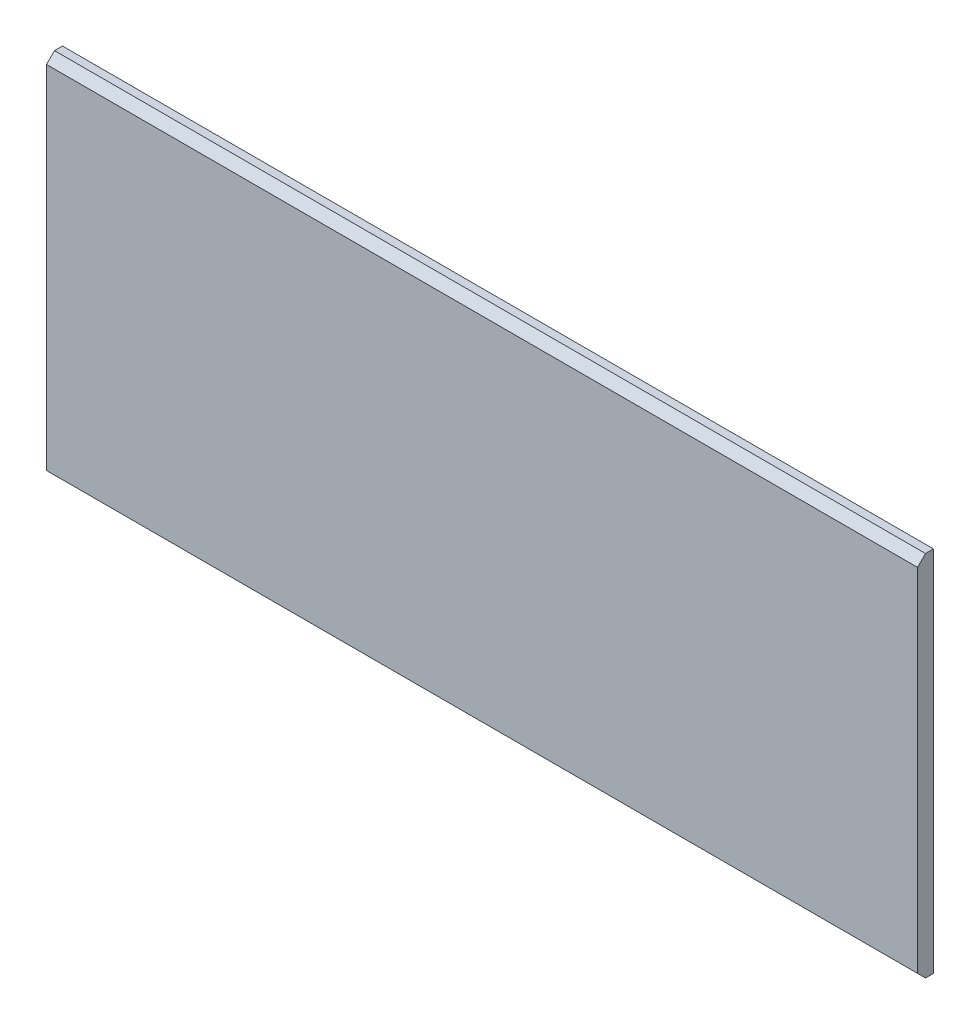
ISO-10303-21;
HEADER;
FILE_DESCRIPTION(('STEP AP214'),'2;1');
FILE_NAME('part.step','',(''),(''),'','','');
FILE_SCHEMA(('AUTOMOTIVE_DESIGN { 1 0 10303 214 1 1 1 1 }'));
ENDSEC;
DATA;
#1=APPLICATION_CONTEXT('core data for automotive mechanical design processes');
#2=APPLICATION_PROTOCOL_DEFINITION('international standard','automotive_design',2000,#1);
#3=PRODUCT_CONTEXT('',#1,'mechanical');
#4=PRODUCT('Part','Part','',(#3));
#5=PRODUCT_RELATED_PRODUCT_CATEGORY('part','',(#4));
#6=PRODUCT_DEFINITION_FORMATION('','',#4);
#7=PRODUCT_DEFINITION_CONTEXT('part definition',#1,'design');
#8=PRODUCT_DEFINITION('design','',#6,#7);
#9=PRODUCT_DEFINITION_SHAPE('','',#8);
#10=(LENGTH_UNIT() NAMED_UNIT(*) SI_UNIT(.MILLI.,.METRE.));
#11=(NAMED_UNIT(*) PLANE_ANGLE_UNIT() SI_UNIT($,.RADIAN.));
#12=(NAMED_UNIT(*) SI_UNIT($,.STERADIAN.) SOLID_ANGLE_UNIT());
#13=UNCERTAINTY_MEASURE_WITH_UNIT(LENGTH_MEASURE(1.E-05),#10,'distance_accuracy_value','');
#14=(GEOMETRIC_REPRESENTATION_CONTEXT(3) GLOBAL_UNCERTAINTY_ASSIGNED_CONTEXT((#13)) GLOBAL_UNIT_ASSIGNED_CONTEXT((#10,
#11,#12)) REPRESENTATION_CONTEXT('',''));
#15=CARTESIAN_POINT('',(0.,0.,0.));
#16=DIRECTION('',(0.,0.,1.));
#17=DIRECTION('',(1.,0.,0.));
#18=AXIS2_PLACEMENT_3D('',#15,#16,#17);
#19=CARTESIAN_POINT('',(272.5,115.,10.));
#20=DIRECTION('',(-1.,0.,0.));
#21=DIRECTION('',(0.,-1.,0.));
#22=AXIS2_PLACEMENT_3D('',#19,#20,#21);
#23=PLANE('',#22);
#24=DIRECTION('',(0.,0.,-1.));
#25=VECTOR('',#24,1.);
#26=CARTESIAN_POINT('',(272.5,115.,10.));
#27=LINE('',#26,#25);
#28=CARTESIAN_POINT('',(272.5,115.,5.00000000000005));
#29=VERTEX_POINT('',#28);
#30=CARTESIAN_POINT('',(272.5,115.,0.));
#31=VERTEX_POINT('',#30);
#32=EDGE_CURVE('E86',#29,#31,#27,.T.);
#33=ORIENTED_EDGE('',*,*,#32,.F.);
#34=DIRECTION('',(0.,-0.707106781186548,0.707106781186548));
#35=VECTOR('',#34,1.);
#36=CARTESIAN_POINT('',(272.5,110.,10.0000000000001));
#37=LINE('',#36,#35);
#38=CARTESIAN_POINT('',(272.5,110.,10.));
#39=VERTEX_POINT('',#38);
#40=EDGE_CURVE('E43',#29,#39,#37,.T.);
#41=ORIENTED_EDGE('',*,*,#40,.T.);
#42=DIRECTION('',(0.,1.,0.));
#43=VECTOR('',#42,1.);
#44=CARTESIAN_POINT('',(272.5,115.,10.));
#45=LINE('',#44,#43);
#46=CARTESIAN_POINT('',(272.5,-110.,10.));
#47=VERTEX_POINT('',#46);
#48=EDGE_CURVE('E114',#47,#39,#45,.T.);
#49=ORIENTED_EDGE('',*,*,#48,.F.);
#50=DIRECTION('',(0.,-0.707106781186548,-0.707106781186548));
#51=VECTOR('',#50,1.);
#52=CARTESIAN_POINT('',(272.5,-110.,9.99999999999993));
#53=LINE('',#52,#51);
#54=CARTESIAN_POINT('',(272.5,-115.,5.00000000000005));
#55=VERTEX_POINT('',#54);
#56=EDGE_CURVE('E50',#47,#55,#53,.T.);
#57=ORIENTED_EDGE('',*,*,#56,.T.);
#58=DIRECTION('',(0.,0.,-1.));
#59=VECTOR('',#58,1.);
#60=CARTESIAN_POINT('',(272.5,-115.,10.));
#61=LINE('',#60,#59);
#62=CARTESIAN_POINT('',(272.5,-115.,0.));
#63=VERTEX_POINT('',#62);
#64=EDGE_CURVE('E104',#55,#63,#61,.T.);
#65=ORIENTED_EDGE('',*,*,#64,.T.);
#66=DIRECTION('',(0.,1.,0.));
#67=VECTOR('',#66,1.);
#68=CARTESIAN_POINT('',(272.5,115.,0.));
#69=LINE('',#68,#67);
#70=EDGE_CURVE('E100',#63,#31,#69,.T.);
#71=ORIENTED_EDGE('',*,*,#70,.T.);
#72=EDGE_LOOP('',(#33,#41,#49,#57,#65,#71));
#73=FACE_BOUND('',#72,.T.);
#74=ADVANCED_FACE('F35',(#73),#23,.F.);
#75=CARTESIAN_POINT('',(-272.5,115.,10.));
#76=DIRECTION('',(0.,-1.,0.));
#77=DIRECTION('',(0.,0.,-1.));
#78=AXIS2_PLACEMENT_3D('',#75,#76,#77);
#79=PLANE('',#78);
#80=DIRECTION('',(0.,0.,-1.));
#81=VECTOR('',#80,1.);
#82=CARTESIAN_POINT('',(-272.5,115.,10.));
#83=LINE('',#82,#81);
#84=CARTESIAN_POINT('',(-272.5,115.,5.00000000000005));
#85=VERTEX_POINT('',#84);
#86=CARTESIAN_POINT('',(-272.5,115.,0.));
#87=VERTEX_POINT('',#86);
#88=EDGE_CURVE('E94',#85,#87,#83,.T.);
#89=ORIENTED_EDGE('',*,*,#88,.F.);
#90=DIRECTION('',(1.,0.,0.));
#91=VECTOR('',#90,1.);
#92=CARTESIAN_POINT('',(272.5,115.,5.00000000000005));
#93=LINE('',#92,#91);
#94=EDGE_CURVE('E58',#85,#29,#93,.T.);
#95=ORIENTED_EDGE('',*,*,#94,.T.);
#96=ORIENTED_EDGE('',*,*,#32,.T.);
#97=DIRECTION('',(-1.,0.,0.));
#98=VECTOR('',#97,1.);
#99=CARTESIAN_POINT('',(-272.5,115.,0.));
#100=LINE('',#99,#98);
#101=EDGE_CURVE('E89',#31,#87,#100,.T.);
#102=ORIENTED_EDGE('',*,*,#101,.T.);
#103=EDGE_LOOP('',(#89,#95,#96,#102));
#104=FACE_BOUND('',#103,.T.);
#105=ADVANCED_FACE('F88',(#104),#79,.F.);
#106=CARTESIAN_POINT('',(-272.5,115.,10.));
#107=DIRECTION('',(1.,0.,0.));
#108=DIRECTION('',(0.,1.,0.));
#109=AXIS2_PLACEMENT_3D('',#106,#107,#108);
#110=PLANE('',#109);
#111=DIRECTION('',(0.,-1.,0.));
#112=VECTOR('',#111,1.);
#113=CARTESIAN_POINT('',(-272.5,115.,10.));
#114=LINE('',#113,#112);
#115=CARTESIAN_POINT('',(-272.5,110.,10.));
#116=VERTEX_POINT('',#115);
#117=CARTESIAN_POINT('',(-272.5,-110.,10.));
#118=VERTEX_POINT('',#117);
#119=EDGE_CURVE('E108',#116,#118,#114,.T.);
#120=ORIENTED_EDGE('',*,*,#119,.F.);
#121=DIRECTION('',(0.,0.707106781186548,-0.707106781186548));
#122=VECTOR('',#121,1.);
#123=CARTESIAN_POINT('',(-272.5,110.,9.99999999999993));
#124=LINE('',#123,#122);
#125=EDGE_CURVE('E126',#116,#85,#124,.T.);
#126=ORIENTED_EDGE('',*,*,#125,.T.);
#127=ORIENTED_EDGE('',*,*,#88,.T.);
#128=DIRECTION('',(0.,-1.,0.));
#129=VECTOR('',#128,1.);
#130=CARTESIAN_POINT('',(-272.5,115.,0.));
#131=LINE('',#130,#129);
#132=CARTESIAN_POINT('',(-272.5,-115.,0.));
#133=VERTEX_POINT('',#132);
#134=EDGE_CURVE('E102',#87,#133,#131,.T.);
#135=ORIENTED_EDGE('',*,*,#134,.T.);
#136=DIRECTION('',(0.,0.,-1.));
#137=VECTOR('',#136,1.);
#138=CARTESIAN_POINT('',(-272.5,-115.,10.));
#139=LINE('',#138,#137);
#140=CARTESIAN_POINT('',(-272.5,-115.,5.00000000000005));
#141=VERTEX_POINT('',#140);
#142=EDGE_CURVE('E116',#141,#133,#139,.T.);
#143=ORIENTED_EDGE('',*,*,#142,.F.);
#144=DIRECTION('',(0.,0.707106781186548,0.707106781186548));
#145=VECTOR('',#144,1.);
#146=CARTESIAN_POINT('',(-272.5,-110.,10.0000000000001));
#147=LINE('',#146,#145);
#148=EDGE_CURVE('E124',#141,#118,#147,.T.);
#149=ORIENTED_EDGE('',*,*,#148,.T.);
#150=EDGE_LOOP('',(#120,#126,#127,#135,#143,#149));
#151=FACE_BOUND('',#150,.T.);
#152=ADVANCED_FACE('F139',(#151),#110,.F.);
#153=CARTESIAN_POINT('',(-272.5,-115.,10.));
#154=DIRECTION('',(0.,1.,0.));
#155=DIRECTION('',(0.,0.,1.));
#156=AXIS2_PLACEMENT_3D('',#153,#154,#155);
#157=PLANE('',#156);
#158=ORIENTED_EDGE('',*,*,#64,.F.);
#159=DIRECTION('',(-1.,0.,0.));
#160=VECTOR('',#159,1.);
#161=CARTESIAN_POINT('',(-272.5,-115.,5.00000000000005));
#162=LINE('',#161,#160);
#163=EDGE_CURVE('E11',#55,#141,#162,.T.);
#164=ORIENTED_EDGE('',*,*,#163,.T.);
#165=ORIENTED_EDGE('',*,*,#142,.T.);
#166=DIRECTION('',(1.,0.,0.));
#167=VECTOR('',#166,1.);
#168=CARTESIAN_POINT('',(-272.5,-115.,0.));
#169=LINE('',#168,#167);
#170=EDGE_CURVE('E112',#133,#63,#169,.T.);
#171=ORIENTED_EDGE('',*,*,#170,.T.);
#172=EDGE_LOOP('',(#158,#164,#165,#171));
#173=FACE_BOUND('',#172,.T.);
#174=ADVANCED_FACE('F145',(#173),#157,.F.);
#175=CARTESIAN_POINT('',(0.,0.,10.));
#176=DIRECTION('',(0.,0.,1.));
#177=DIRECTION('',(1.,0.,0.));
#178=AXIS2_PLACEMENT_3D('',#175,#176,#177);
#179=PLANE('',#178);
#180=ORIENTED_EDGE('',*,*,#48,.T.);
#181=DIRECTION('',(-1.,0.,0.));
#182=VECTOR('',#181,1.);
#183=CARTESIAN_POINT('',(-272.5,110.,10.));
#184=LINE('',#183,#182);
#185=EDGE_CURVE('E121',#39,#116,#184,.T.);
#186=ORIENTED_EDGE('',*,*,#185,.T.);
#187=ORIENTED_EDGE('',*,*,#119,.T.);
#188=DIRECTION('',(1.,0.,0.));
#189=VECTOR('',#188,1.);
#190=CARTESIAN_POINT('',(272.5,-110.,10.));
#191=LINE('',#190,#189);
#192=EDGE_CURVE('E93',#118,#47,#191,.T.);
#193=ORIENTED_EDGE('',*,*,#192,.T.);
#194=EDGE_LOOP('',(#180,#186,#187,#193));
#195=FACE_BOUND('',#194,.T.);
#196=ADVANCED_FACE('F133',(#195),#179,.T.);
#197=CARTESIAN_POINT('',(0.,0.,0.));
#198=DIRECTION('',(0.,0.,1.));
#199=DIRECTION('',(1.,0.,0.));
#200=AXIS2_PLACEMENT_3D('',#197,#198,#199);
#201=PLANE('',#200);
#202=ORIENTED_EDGE('',*,*,#70,.F.);
#203=ORIENTED_EDGE('',*,*,#170,.F.);
#204=ORIENTED_EDGE('',*,*,#134,.F.);
#205=ORIENTED_EDGE('',*,*,#101,.F.);
#206=EDGE_LOOP('',(#202,#203,#204,#205));
#207=FACE_BOUND('',#206,.T.);
#208=ADVANCED_FACE('F98',(#207),#201,.F.);
#209=CARTESIAN_POINT('',(0.,110.,10.));
#210=DIRECTION('',(0.,0.707106781186547,0.707106781186547));
#211=DIRECTION('',(1.,0.,0.));
#212=AXIS2_PLACEMENT_3D('',#209,#210,#211);
#213=PLANE('',#212);
#214=ORIENTED_EDGE('',*,*,#40,.F.);
#215=ORIENTED_EDGE('',*,*,#94,.F.);
#216=ORIENTED_EDGE('',*,*,#125,.F.);
#217=ORIENTED_EDGE('',*,*,#185,.F.);
#218=EDGE_LOOP('',(#214,#215,#216,#217));
#219=FACE_BOUND('',#218,.T.);
#220=ADVANCED_FACE('F137',(#219),#213,.T.);
#221=CARTESIAN_POINT('',(0.,-110.,10.));
#222=DIRECTION('',(0.,-0.707106781186547,0.707106781186547));
#223=DIRECTION('',(-1.,0.,0.));
#224=AXIS2_PLACEMENT_3D('',#221,#222,#223);
#225=PLANE('',#224);
#226=ORIENTED_EDGE('',*,*,#148,.F.);
#227=ORIENTED_EDGE('',*,*,#163,.F.);
#228=ORIENTED_EDGE('',*,*,#56,.F.);
#229=ORIENTED_EDGE('',*,*,#192,.F.);
#230=EDGE_LOOP('',(#226,#227,#228,#229));
#231=FACE_BOUND('',#230,.T.);
#232=ADVANCED_FACE('F37',(#231),#225,.T.);
#233=CLOSED_SHELL('',(#74,#105,#152,#174,#196,#208,#220,#232));
#234=MANIFOLD_SOLID_BREP('B2',#233);
#235=ADVANCED_BREP_SHAPE_REPRESENTATION('',(#18,#234),#14);
#236=SHAPE_DEFINITION_REPRESENTATION(#9,#235);
ENDSEC;
END-ISO-10303-21;
